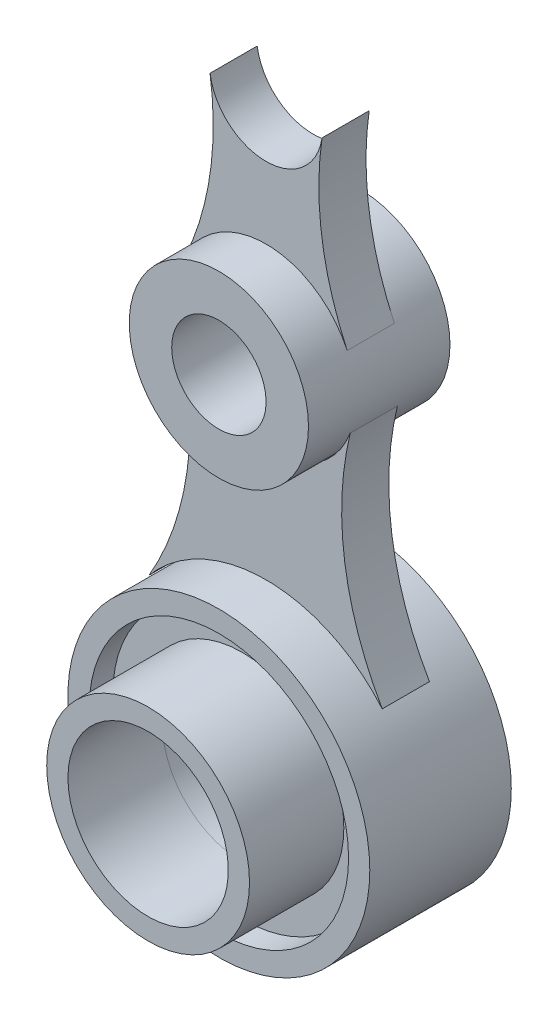
ISO-10303-21;
HEADER;
FILE_DESCRIPTION(('STEP AP214'),'2;1');
FILE_NAME('part.step','',(''),(''),'','','');
FILE_SCHEMA(('AUTOMOTIVE_DESIGN { 1 0 10303 214 1 1 1 1 }'));
ENDSEC;
DATA;
#1=APPLICATION_CONTEXT('core data for automotive mechanical design processes');
#2=APPLICATION_PROTOCOL_DEFINITION('international standard','automotive_design',2000,#1);
#3=PRODUCT_CONTEXT('',#1,'mechanical');
#4=PRODUCT('Part','Part','',(#3));
#5=PRODUCT_RELATED_PRODUCT_CATEGORY('part','',(#4));
#6=PRODUCT_DEFINITION_FORMATION('','',#4);
#7=PRODUCT_DEFINITION_CONTEXT('part definition',#1,'design');
#8=PRODUCT_DEFINITION('design','',#6,#7);
#9=PRODUCT_DEFINITION_SHAPE('','',#8);
#10=(LENGTH_UNIT() NAMED_UNIT(*) SI_UNIT(.MILLI.,.METRE.));
#11=(NAMED_UNIT(*) PLANE_ANGLE_UNIT() SI_UNIT($,.RADIAN.));
#12=(NAMED_UNIT(*) SI_UNIT($,.STERADIAN.) SOLID_ANGLE_UNIT());
#13=UNCERTAINTY_MEASURE_WITH_UNIT(LENGTH_MEASURE(1.E-05),#10,'distance_accuracy_value','');
#14=(GEOMETRIC_REPRESENTATION_CONTEXT(3) GLOBAL_UNCERTAINTY_ASSIGNED_CONTEXT((#13)) GLOBAL_UNIT_ASSIGNED_CONTEXT((#10,
#11,#12)) REPRESENTATION_CONTEXT('',''));
#15=CARTESIAN_POINT('',(0.,0.,0.));
#16=DIRECTION('',(0.,0.,1.));
#17=DIRECTION('',(1.,0.,0.));
#18=AXIS2_PLACEMENT_3D('',#15,#16,#17);
#19=CARTESIAN_POINT('',(3.85775487195288,-22.9324343422919,45.));
#20=DIRECTION('',(0.,0.,-1.));
#21=DIRECTION('',(-1.,0.,0.));
#22=AXIS2_PLACEMENT_3D('',#19,#20,#21);
#23=CYLINDRICAL_SURFACE('',#22,21.5);
#24=CARTESIAN_POINT('',(3.85775487195288,-22.9324343422919,45.));
#25=DIRECTION('',(0.,0.,1.));
#26=DIRECTION('',(1.,0.,0.));
#27=AXIS2_PLACEMENT_3D('',#24,#25,#26);
#28=CIRCLE('',#27,21.5);
#29=CARTESIAN_POINT('',(25.3577548719529,-22.9324343422919,45.));
#30=VERTEX_POINT('',#29);
#31=EDGE_CURVE('E11',#30,#30,#28,.T.);
#32=ORIENTED_EDGE('',*,*,#31,.F.);
#33=EDGE_LOOP('',(#32));
#34=FACE_BOUND('',#33,.T.);
#35=CARTESIAN_POINT('',(3.85775487195288,-22.9324343422919,25.));
#36=DIRECTION('',(0.,0.,1.));
#37=DIRECTION('',(1.,0.,0.));
#38=AXIS2_PLACEMENT_3D('',#35,#36,#37);
#39=CIRCLE('',#38,21.5);
#40=CARTESIAN_POINT('',(25.3577548719529,-22.9324343422919,25.));
#41=VERTEX_POINT('',#40);
#42=EDGE_CURVE('E51',#41,#41,#39,.T.);
#43=ORIENTED_EDGE('',*,*,#42,.T.);
#44=EDGE_LOOP('',(#43));
#45=FACE_BOUND('',#44,.T.);
#46=ADVANCED_FACE('F44',(#34,#45),#23,.T.);
#47=CARTESIAN_POINT('',(3.85775487195288,-22.9324343422919,45.));
#48=DIRECTION('',(0.,0.,1.));
#49=DIRECTION('',(1.,0.,0.));
#50=AXIS2_PLACEMENT_3D('',#47,#48,#49);
#51=PLANE('',#50);
#52=CARTESIAN_POINT('',(3.85775487195288,-22.9324343422919,45.));
#53=DIRECTION('',(0.,0.,1.));
#54=DIRECTION('',(1.,0.,0.));
#55=AXIS2_PLACEMENT_3D('',#52,#53,#54);
#56=CIRCLE('',#55,17.);
#57=CARTESIAN_POINT('',(-13.1422451280471,-22.9324343422919,45.));
#58=VERTEX_POINT('',#57);
#59=EDGE_CURVE('E57',#58,#58,#56,.T.);
#60=ORIENTED_EDGE('',*,*,#59,.F.);
#61=EDGE_LOOP('',(#60));
#62=FACE_BOUND('',#61,.T.);
#63=ORIENTED_EDGE('',*,*,#31,.T.);
#64=EDGE_LOOP('',(#63));
#65=FACE_BOUND('',#64,.T.);
#66=ADVANCED_FACE('F69',(#62,#65),#51,.T.);
#67=CARTESIAN_POINT('',(3.85775487195288,-22.9324343422919,25.));
#68=DIRECTION('',(0.,0.,1.));
#69=DIRECTION('',(1.,0.,0.));
#70=AXIS2_PLACEMENT_3D('',#67,#68,#69);
#71=PLANE('',#70);
#72=CARTESIAN_POINT('',(3.85775487195288,-22.9324343422919,25.));
#73=DIRECTION('',(0.,0.,1.));
#74=DIRECTION('',(1.,0.,0.));
#75=AXIS2_PLACEMENT_3D('',#72,#73,#74);
#76=CIRCLE('',#75,17.);
#77=CARTESIAN_POINT('',(-13.1422451280471,-22.9324343422919,25.));
#78=VERTEX_POINT('',#77);
#79=EDGE_CURVE('E47',#78,#78,#76,.F.);
#80=ORIENTED_EDGE('',*,*,#79,.F.);
#81=EDGE_LOOP('',(#80));
#82=FACE_BOUND('',#81,.T.);
#83=ORIENTED_EDGE('',*,*,#42,.F.);
#84=EDGE_LOOP('',(#83));
#85=FACE_BOUND('',#84,.T.);
#86=ADVANCED_FACE('F66',(#82,#85),#71,.F.);
#87=CARTESIAN_POINT('',(3.85775487195288,-22.9324343422919,45.));
#88=DIRECTION('',(0.,0.,-1.));
#89=DIRECTION('',(-1.,0.,0.));
#90=AXIS2_PLACEMENT_3D('',#87,#88,#89);
#91=CYLINDRICAL_SURFACE('',#90,17.);
#92=CARTESIAN_POINT('',(-13.1422451280471,-22.9324343422919,45.));
#93=CARTESIAN_POINT('',(-13.1422451280471,-22.9324343422919,44.7916666666667));
#94=CARTESIAN_POINT('',(-13.1422451280471,-22.9324343422919,44.5833333333333));
#95=CARTESIAN_POINT('',(-13.1422451280471,-22.9324343422919,44.1666666666667));
#96=CARTESIAN_POINT('',(-13.1422451280471,-22.9324343422919,43.9583333333333));
#97=CARTESIAN_POINT('',(-13.1422451280471,-22.9324343422919,43.5416666666667));
#98=CARTESIAN_POINT('',(-13.1422451280471,-22.9324343422919,43.3333333333333));
#99=CARTESIAN_POINT('',(-13.1422451280471,-22.9324343422919,42.9166666666667));
#100=CARTESIAN_POINT('',(-13.1422451280471,-22.9324343422919,42.7083333333333));
#101=CARTESIAN_POINT('',(-13.1422451280471,-22.9324343422919,42.2916666666667));
#102=CARTESIAN_POINT('',(-13.1422451280471,-22.9324343422919,42.0833333333333));
#103=CARTESIAN_POINT('',(-13.1422451280471,-22.9324343422919,41.6666666666667));
#104=CARTESIAN_POINT('',(-13.1422451280471,-22.9324343422919,41.4583333333333));
#105=CARTESIAN_POINT('',(-13.1422451280471,-22.9324343422919,41.0416666666667));
#106=CARTESIAN_POINT('',(-13.1422451280471,-22.9324343422919,40.8333333333333));
#107=CARTESIAN_POINT('',(-13.1422451280471,-22.9324343422919,40.4166666666667));
#108=CARTESIAN_POINT('',(-13.1422451280471,-22.9324343422919,40.2083333333333));
#109=CARTESIAN_POINT('',(-13.1422451280471,-22.9324343422919,39.7916666666667));
#110=CARTESIAN_POINT('',(-13.1422451280471,-22.9324343422919,39.5833333333333));
#111=CARTESIAN_POINT('',(-13.1422451280471,-22.9324343422919,39.1666666666667));
#112=CARTESIAN_POINT('',(-13.1422451280471,-22.9324343422919,38.9583333333333));
#113=CARTESIAN_POINT('',(-13.1422451280471,-22.9324343422919,38.5416666666667));
#114=CARTESIAN_POINT('',(-13.1422451280471,-22.9324343422919,38.3333333333333));
#115=CARTESIAN_POINT('',(-13.1422451280471,-22.9324343422919,37.9166666666667));
#116=CARTESIAN_POINT('',(-13.1422451280471,-22.9324343422919,37.7083333333333));
#117=CARTESIAN_POINT('',(-13.1422451280471,-22.9324343422919,37.2916666666667));
#118=CARTESIAN_POINT('',(-13.1422451280471,-22.9324343422919,37.0833333333333));
#119=CARTESIAN_POINT('',(-13.1422451280471,-22.9324343422919,36.6666666666667));
#120=CARTESIAN_POINT('',(-13.1422451280471,-22.9324343422919,36.4583333333333));
#121=CARTESIAN_POINT('',(-13.1422451280471,-22.9324343422919,36.0416666666667));
#122=CARTESIAN_POINT('',(-13.1422451280471,-22.9324343422919,35.8333333333333));
#123=CARTESIAN_POINT('',(-13.1422451280471,-22.9324343422919,35.4166666666667));
#124=CARTESIAN_POINT('',(-13.1422451280471,-22.9324343422919,35.2083333333333));
#125=CARTESIAN_POINT('',(-13.1422451280471,-22.9324343422919,34.7916666666667));
#126=CARTESIAN_POINT('',(-13.1422451280471,-22.9324343422919,34.5833333333333));
#127=CARTESIAN_POINT('',(-13.1422451280471,-22.9324343422919,34.1666666666667));
#128=CARTESIAN_POINT('',(-13.1422451280471,-22.9324343422919,33.9583333333333));
#129=CARTESIAN_POINT('',(-13.1422451280471,-22.9324343422919,33.5416666666667));
#130=CARTESIAN_POINT('',(-13.1422451280471,-22.9324343422919,33.3333333333333));
#131=CARTESIAN_POINT('',(-13.1422451280471,-22.9324343422919,32.9166666666667));
#132=CARTESIAN_POINT('',(-13.1422451280471,-22.9324343422919,32.7083333333333));
#133=CARTESIAN_POINT('',(-13.1422451280471,-22.9324343422919,32.2916666666667));
#134=CARTESIAN_POINT('',(-13.1422451280471,-22.9324343422919,32.0833333333333));
#135=CARTESIAN_POINT('',(-13.1422451280471,-22.9324343422919,31.6666666666667));
#136=CARTESIAN_POINT('',(-13.1422451280471,-22.9324343422919,31.4583333333333));
#137=CARTESIAN_POINT('',(-13.1422451280471,-22.9324343422919,31.0416666666667));
#138=CARTESIAN_POINT('',(-13.1422451280471,-22.9324343422919,30.8333333333333));
#139=CARTESIAN_POINT('',(-13.1422451280471,-22.9324343422919,30.4166666666667));
#140=CARTESIAN_POINT('',(-13.1422451280471,-22.9324343422919,30.2083333333333));
#141=CARTESIAN_POINT('',(-13.1422451280471,-22.9324343422919,29.7916666666667));
#142=CARTESIAN_POINT('',(-13.1422451280471,-22.9324343422919,29.5833333333333));
#143=CARTESIAN_POINT('',(-13.1422451280471,-22.9324343422919,29.1666666666667));
#144=CARTESIAN_POINT('',(-13.1422451280471,-22.9324343422919,28.9583333333333));
#145=CARTESIAN_POINT('',(-13.1422451280471,-22.9324343422919,28.5416666666667));
#146=CARTESIAN_POINT('',(-13.1422451280471,-22.9324343422919,28.3333333333333));
#147=CARTESIAN_POINT('',(-13.1422451280471,-22.9324343422919,27.9166666666667));
#148=CARTESIAN_POINT('',(-13.1422451280471,-22.9324343422919,27.7083333333333));
#149=CARTESIAN_POINT('',(-13.1422451280471,-22.9324343422919,27.2916666666667));
#150=CARTESIAN_POINT('',(-13.1422451280471,-22.9324343422919,27.0833333333333));
#151=CARTESIAN_POINT('',(-13.1422451280471,-22.9324343422919,26.6666666666667));
#152=CARTESIAN_POINT('',(-13.1422451280471,-22.9324343422919,26.4583333333333));
#153=CARTESIAN_POINT('',(-13.1422451280471,-22.9324343422919,26.0416666666667));
#154=CARTESIAN_POINT('',(-13.1422451280471,-22.9324343422919,25.8333333333333));
#155=CARTESIAN_POINT('',(-13.1422451280471,-22.9324343422919,25.4166666666667));
#156=CARTESIAN_POINT('',(-13.1422451280471,-22.9324343422919,25.2083333333333));
#157=CARTESIAN_POINT('',(-13.1422451280471,-22.9324343422919,25.));
#158=B_SPLINE_CURVE_WITH_KNOTS('',3,(#92,#93,#94,#95,#96,#97,#98,#99,#100,#101,#102,#103,#104,
#105,#106,#107,#108,#109,#110,#111,#112,#113,#114,#115,#116,#117,#118,#119,#120,#121,#122,#123,
#124,#125,#126,#127,#128,#129,#130,#131,#132,#133,#134,#135,#136,#137,#138,#139,#140,#141,#142,
#143,#144,#145,#146,#147,#148,#149,#150,#151,#152,#153,#154,#155,#156,#157),.UNSPECIFIED.,.F.,
.F.,(4,2,2,2,2,2,2,2,2,2,2,2,2,2,2,2,2,2,2,2,2,2,2,2,2,2,2,2,2,2,2,2,4),(0.,0.625000000000001,
1.25,1.875,2.5,3.125,3.75,4.375,5.,5.62500000000001,6.25000000000001,6.87500000000001,7.5,8.125,
8.75,9.375,10.,10.625,11.25,11.875,12.5,13.125,13.75,14.375,15.,15.625,16.25,16.875,17.5,18.125,
18.75,19.375,20.),.UNSPECIFIED.);
#159=EDGE_CURVE('BSEAM64',#58,#78,#158,.T.);
#160=ORIENTED_EDGE('',*,*,#59,.T.);
#161=ORIENTED_EDGE('',*,*,#79,.T.);
#162=ORIENTED_EDGE('',*,*,#159,.T.);
#163=ORIENTED_EDGE('',*,*,#159,.F.);
#164=EDGE_LOOP('',(#160,#162,#161,#163));
#165=FACE_BOUND('',#164,.T.);
#166=ADVANCED_FACE('F64',(#165),#91,.F.);
#167=CLOSED_SHELL('',(#46,#66,#86,#166));
#168=MANIFOLD_SOLID_BREP('B2',#167);
#169=CARTESIAN_POINT('',(3.85775487195288,52.0675656577081,20.));
#170=DIRECTION('',(0.,0.,-1.));
#171=DIRECTION('',(-1.,0.,0.));
#172=AXIS2_PLACEMENT_3D('',#169,#170,#171);
#173=CYLINDRICAL_SURFACE('',#172,19.1140032956474);
#174=CARTESIAN_POINT('',(3.85775487195288,52.0675656577081,10.));
#175=DIRECTION('',(0.,0.,1.));
#176=DIRECTION('',(1.,0.,0.));
#177=AXIS2_PLACEMENT_3D('',#174,#175,#176);
#178=CIRCLE('',#177,19.1140032956474);
#179=CARTESIAN_POINT('',(-14.1336658812878,45.6135822934687,10.));
#180=VERTEX_POINT('',#179);
#181=CARTESIAN_POINT('',(21.7194099460259,45.2626850561943,10.));
#182=VERTEX_POINT('',#181);
#183=EDGE_CURVE('E177',#180,#182,#178,.T.);
#184=ORIENTED_EDGE('',*,*,#183,.F.);
#185=DIRECTION('',(0.,0.,-1.));
#186=VECTOR('',#185,1.);
#187=CARTESIAN_POINT('',(-14.1336658812878,45.6135822934687,20.));
#188=LINE('',#187,#186);
#189=CARTESIAN_POINT('',(-14.1336658812878,45.6135822934687,20.));
#190=VERTEX_POINT('',#189);
#191=EDGE_CURVE('E42',#190,#180,#188,.T.);
#192=ORIENTED_EDGE('',*,*,#191,.F.);
#193=CARTESIAN_POINT('',(3.85775487195288,52.0675656577081,20.));
#194=DIRECTION('',(0.,0.,1.));
#195=DIRECTION('',(1.,0.,0.));
#196=AXIS2_PLACEMENT_3D('',#193,#194,#195);
#197=CIRCLE('',#196,19.1140032956474);
#198=CARTESIAN_POINT('',(21.7194099460259,45.2626850561943,20.));
#199=VERTEX_POINT('',#198);
#200=EDGE_CURVE('E162',#190,#199,#197,.T.);
#201=ORIENTED_EDGE('',*,*,#200,.T.);
#202=DIRECTION('',(0.,0.,-1.));
#203=VECTOR('',#202,1.);
#204=CARTESIAN_POINT('',(21.7194099460259,45.2626850561943,20.));
#205=LINE('',#204,#203);
#206=EDGE_CURVE('E130',#199,#182,#205,.T.);
#207=ORIENTED_EDGE('',*,*,#206,.T.);
#208=EDGE_LOOP('',(#184,#192,#201,#207));
#209=FACE_BOUND('',#208,.T.);
#210=ADVANCED_FACE('F114',(#209),#173,.F.);
#211=CARTESIAN_POINT('',(-76.2256850609005,30.102903578512,20.));
#212=DIRECTION('',(0.,0.,-1.));
#213=DIRECTION('',(-1.,0.,0.));
#214=AXIS2_PLACEMENT_3D('',#211,#212,#213);
#215=CYLINDRICAL_SURFACE('',#214,64.);
#216=CARTESIAN_POINT('',(-76.2256850609005,30.102903578512,10.));
#217=DIRECTION('',(0.,0.,1.));
#218=DIRECTION('',(1.,0.,0.));
#219=AXIS2_PLACEMENT_3D('',#216,#217,#218);
#220=CIRCLE('',#219,64.);
#221=CARTESIAN_POINT('',(-20.9821591681092,-2.21045042463196,10.));
#222=VERTEX_POINT('',#221);
#223=EDGE_CURVE('E168',#180,#222,#220,.F.);
#224=ORIENTED_EDGE('',*,*,#223,.T.);
#225=DIRECTION('',(0.,0.,-1.));
#226=VECTOR('',#225,1.);
#227=CARTESIAN_POINT('',(-20.9821591681092,-2.21045042463196,20.));
#228=LINE('',#227,#226);
#229=CARTESIAN_POINT('',(-20.9821591681092,-2.21045042463196,20.));
#230=VERTEX_POINT('',#229);
#231=EDGE_CURVE('E122',#230,#222,#228,.T.);
#232=ORIENTED_EDGE('',*,*,#231,.F.);
#233=CARTESIAN_POINT('',(-76.2256850609005,30.102903578512,20.));
#234=DIRECTION('',(0.,0.,1.));
#235=DIRECTION('',(1.,0.,0.));
#236=AXIS2_PLACEMENT_3D('',#233,#234,#235);
#237=CIRCLE('',#236,64.);
#238=EDGE_CURVE('E156',#190,#230,#237,.F.);
#239=ORIENTED_EDGE('',*,*,#238,.F.);
#240=ORIENTED_EDGE('',*,*,#191,.T.);
#241=EDGE_LOOP('',(#224,#232,#239,#240));
#242=FACE_BOUND('',#241,.T.);
#243=ADVANCED_FACE('F166',(#242),#215,.F.);
#244=CARTESIAN_POINT('',(3.85775487195288,-22.9324343422919,20.));
#245=DIRECTION('',(0.,0.,-1.));
#246=DIRECTION('',(-1.,0.,0.));
#247=AXIS2_PLACEMENT_3D('',#244,#245,#246);
#248=CYLINDRICAL_SURFACE('',#247,32.348445820494);
#249=CARTESIAN_POINT('',(3.85775487195288,-22.9324343422919,10.));
#250=DIRECTION('',(0.,0.,1.));
#251=DIRECTION('',(1.,0.,0.));
#252=AXIS2_PLACEMENT_3D('',#249,#250,#251);
#253=CIRCLE('',#252,32.348445820494);
#254=CARTESIAN_POINT('',(28.4993570682115,-1.97501588956315,10.));
#255=VERTEX_POINT('',#254);
#256=EDGE_CURVE('E180',#255,#222,#253,.T.);
#257=ORIENTED_EDGE('',*,*,#256,.F.);
#258=DIRECTION('',(0.,0.,-1.));
#259=VECTOR('',#258,1.);
#260=CARTESIAN_POINT('',(28.4993570682115,-1.97501588956315,20.));
#261=LINE('',#260,#259);
#262=CARTESIAN_POINT('',(28.4993570682115,-1.97501588956315,20.));
#263=VERTEX_POINT('',#262);
#264=EDGE_CURVE('E143',#263,#255,#261,.T.);
#265=ORIENTED_EDGE('',*,*,#264,.F.);
#266=CARTESIAN_POINT('',(3.85775487195288,-22.9324343422919,20.));
#267=DIRECTION('',(0.,0.,1.));
#268=DIRECTION('',(1.,0.,0.));
#269=AXIS2_PLACEMENT_3D('',#266,#267,#268);
#270=CIRCLE('',#269,32.348445820494);
#271=EDGE_CURVE('E161',#263,#230,#270,.T.);
#272=ORIENTED_EDGE('',*,*,#271,.T.);
#273=ORIENTED_EDGE('',*,*,#231,.T.);
#274=EDGE_LOOP('',(#257,#265,#272,#273));
#275=FACE_BOUND('',#274,.T.);
#276=ADVANCED_FACE('F171',(#275),#248,.F.);
#277=CARTESIAN_POINT('',(83.8926628114819,30.0808989910414,20.));
#278=DIRECTION('',(0.,0.,-1.));
#279=DIRECTION('',(-1.,0.,0.));
#280=AXIS2_PLACEMENT_3D('',#277,#278,#279);
#281=CYLINDRICAL_SURFACE('',#280,64.);
#282=CARTESIAN_POINT('',(83.8926628114819,30.0808989910414,10.));
#283=DIRECTION('',(0.,0.,1.));
#284=DIRECTION('',(1.,0.,0.));
#285=AXIS2_PLACEMENT_3D('',#282,#283,#284);
#286=CIRCLE('',#285,64.);
#287=EDGE_CURVE('E182',#182,#255,#286,.T.);
#288=ORIENTED_EDGE('',*,*,#287,.F.);
#289=ORIENTED_EDGE('',*,*,#206,.F.);
#290=CARTESIAN_POINT('',(83.8926628114819,30.0808989910414,20.));
#291=DIRECTION('',(0.,0.,1.));
#292=DIRECTION('',(1.,0.,0.));
#293=AXIS2_PLACEMENT_3D('',#290,#291,#292);
#294=CIRCLE('',#293,64.);
#295=EDGE_CURVE('E172',#199,#263,#294,.T.);
#296=ORIENTED_EDGE('',*,*,#295,.T.);
#297=ORIENTED_EDGE('',*,*,#264,.T.);
#298=EDGE_LOOP('',(#288,#289,#296,#297));
#299=FACE_BOUND('',#298,.T.);
#300=ADVANCED_FACE('F187',(#299),#281,.F.);
#301=CARTESIAN_POINT('',(0.,0.,20.));
#302=DIRECTION('',(0.,0.,1.));
#303=DIRECTION('',(1.,0.,0.));
#304=AXIS2_PLACEMENT_3D('',#301,#302,#303);
#305=PLANE('',#304);
#306=ORIENTED_EDGE('',*,*,#200,.F.);
#307=ORIENTED_EDGE('',*,*,#238,.T.);
#308=ORIENTED_EDGE('',*,*,#271,.F.);
#309=ORIENTED_EDGE('',*,*,#295,.F.);
#310=EDGE_LOOP('',(#306,#307,#308,#309));
#311=FACE_BOUND('',#310,.T.);
#312=ADVANCED_FACE('F158',(#311),#305,.T.);
#313=CARTESIAN_POINT('',(0.,0.,10.));
#314=DIRECTION('',(0.,0.,1.));
#315=DIRECTION('',(1.,0.,0.));
#316=AXIS2_PLACEMENT_3D('',#313,#314,#315);
#317=PLANE('',#316);
#318=ORIENTED_EDGE('',*,*,#183,.T.);
#319=ORIENTED_EDGE('',*,*,#287,.T.);
#320=ORIENTED_EDGE('',*,*,#256,.T.);
#321=ORIENTED_EDGE('',*,*,#223,.F.);
#322=EDGE_LOOP('',(#318,#319,#320,#321));
#323=FACE_BOUND('',#322,.T.);
#324=ADVANCED_FACE('F194',(#323),#317,.F.);
#325=CLOSED_SHELL('',(#210,#243,#276,#300,#312,#324));
#326=MANIFOLD_SOLID_BREP('B6',#325);
#327=CARTESIAN_POINT('',(3.85775487195288,-22.9324343422919,30.));
#328=DIRECTION('',(0.,0.,-1.));
#329=DIRECTION('',(-1.,0.,0.));
#330=AXIS2_PLACEMENT_3D('',#327,#328,#329);
#331=CYLINDRICAL_SURFACE('',#330,32.);
#332=CARTESIAN_POINT('',(3.85775487195288,-22.9324343422919,30.));
#333=DIRECTION('',(0.,0.,1.));
#334=DIRECTION('',(1.,0.,0.));
#335=AXIS2_PLACEMENT_3D('',#332,#333,#334);
#336=CIRCLE('',#335,32.);
#337=CARTESIAN_POINT('',(35.8577548719529,-22.9324343422919,30.));
#338=VERTEX_POINT('',#337);
#339=EDGE_CURVE('E113',#338,#338,#336,.T.);
#340=ORIENTED_EDGE('',*,*,#339,.F.);
#341=EDGE_LOOP('',(#340));
#342=FACE_BOUND('',#341,.T.);
#343=CARTESIAN_POINT('',(3.85775487195288,-22.9324343422919,0.));
#344=DIRECTION('',(0.,0.,1.));
#345=DIRECTION('',(1.,0.,0.));
#346=AXIS2_PLACEMENT_3D('',#343,#344,#345);
#347=CIRCLE('',#346,32.);
#348=CARTESIAN_POINT('',(35.8577548719529,-22.9324343422919,0.));
#349=VERTEX_POINT('',#348);
#350=EDGE_CURVE('E254',#349,#349,#347,.T.);
#351=ORIENTED_EDGE('',*,*,#350,.T.);
#352=EDGE_LOOP('',(#351));
#353=FACE_BOUND('',#352,.T.);
#354=ADVANCED_FACE('F247',(#342,#353),#331,.T.);
#355=CARTESIAN_POINT('',(3.85775487195288,-22.9324343422919,30.));
#356=DIRECTION('',(0.,0.,1.));
#357=DIRECTION('',(1.,0.,0.));
#358=AXIS2_PLACEMENT_3D('',#355,#356,#357);
#359=PLANE('',#358);
#360=CARTESIAN_POINT('',(3.85775487195288,-22.9324343422919,30.));
#361=DIRECTION('',(0.,0.,1.));
#362=DIRECTION('',(1.,0.,0.));
#363=AXIS2_PLACEMENT_3D('',#360,#361,#362);
#364=CIRCLE('',#363,27.5);
#365=CARTESIAN_POINT('',(31.3577548719529,-22.9324343422919,30.));
#366=VERTEX_POINT('',#365);
#367=EDGE_CURVE('E259',#366,#366,#364,.T.);
#368=ORIENTED_EDGE('',*,*,#367,.F.);
#369=EDGE_LOOP('',(#368));
#370=FACE_BOUND('',#369,.T.);
#371=ORIENTED_EDGE('',*,*,#339,.T.);
#372=EDGE_LOOP('',(#371));
#373=FACE_BOUND('',#372,.T.);
#374=ADVANCED_FACE('F286',(#370,#373),#359,.T.);
#375=CARTESIAN_POINT('',(3.85775487195288,-22.9324343422919,0.));
#376=DIRECTION('',(0.,0.,1.));
#377=DIRECTION('',(1.,0.,0.));
#378=AXIS2_PLACEMENT_3D('',#375,#376,#377);
#379=PLANE('',#378);
#380=CARTESIAN_POINT('',(3.85775487195288,-22.9324343422919,0.));
#381=DIRECTION('',(0.,0.,1.));
#382=DIRECTION('',(1.,0.,0.));
#383=AXIS2_PLACEMENT_3D('',#380,#381,#382);
#384=CIRCLE('',#383,17.);
#385=CARTESIAN_POINT('',(-13.1422451280471,-22.9324343422919,0.));
#386=VERTEX_POINT('',#385);
#387=EDGE_CURVE('E266',#386,#386,#384,.T.);
#388=ORIENTED_EDGE('',*,*,#387,.T.);
#389=EDGE_LOOP('',(#388));
#390=FACE_BOUND('',#389,.T.);
#391=ORIENTED_EDGE('',*,*,#350,.F.);
#392=EDGE_LOOP('',(#391));
#393=FACE_BOUND('',#392,.T.);
#394=ADVANCED_FACE('F291',(#390,#393),#379,.F.);
#395=CARTESIAN_POINT('',(3.85775487195288,-22.9324343422919,30.));
#396=DIRECTION('',(0.,0.,-1.));
#397=DIRECTION('',(-1.,0.,0.));
#398=AXIS2_PLACEMENT_3D('',#395,#396,#397);
#399=CYLINDRICAL_SURFACE('',#398,27.5);
#400=ORIENTED_EDGE('',*,*,#367,.T.);
#401=EDGE_LOOP('',(#400));
#402=FACE_BOUND('',#401,.T.);
#403=CARTESIAN_POINT('',(3.85775487195288,-22.9324343422919,25.));
#404=DIRECTION('',(0.,0.,1.));
#405=DIRECTION('',(1.,0.,0.));
#406=AXIS2_PLACEMENT_3D('',#403,#404,#405);
#407=CIRCLE('',#406,27.5);
#408=CARTESIAN_POINT('',(31.3577548719529,-22.9324343422919,25.));
#409=VERTEX_POINT('',#408);
#410=EDGE_CURVE('E261',#409,#409,#407,.T.);
#411=ORIENTED_EDGE('',*,*,#410,.F.);
#412=EDGE_LOOP('',(#411));
#413=FACE_BOUND('',#412,.T.);
#414=ADVANCED_FACE('F283',(#402,#413),#399,.F.);
#415=CARTESIAN_POINT('',(3.85775487195288,-22.9324343422919,25.));
#416=DIRECTION('',(0.,0.,1.));
#417=DIRECTION('',(1.,0.,0.));
#418=AXIS2_PLACEMENT_3D('',#415,#416,#417);
#419=PLANE('',#418);
#420=CARTESIAN_POINT('',(3.85775487195288,-22.9324343422919,25.));
#421=DIRECTION('',(0.,0.,1.));
#422=DIRECTION('',(1.,0.,0.));
#423=AXIS2_PLACEMENT_3D('',#420,#421,#422);
#424=CIRCLE('',#423,17.);
#425=CARTESIAN_POINT('',(-13.1422451280471,-22.9324343422919,25.));
#426=VERTEX_POINT('',#425);
#427=EDGE_CURVE('E250',#426,#426,#424,.F.);
#428=ORIENTED_EDGE('',*,*,#427,.T.);
#429=EDGE_LOOP('',(#428));
#430=FACE_BOUND('',#429,.T.);
#431=ORIENTED_EDGE('',*,*,#410,.T.);
#432=EDGE_LOOP('',(#431));
#433=FACE_BOUND('',#432,.T.);
#434=ADVANCED_FACE('F273',(#430,#433),#419,.T.);
#435=CARTESIAN_POINT('',(3.85775487195288,-22.9324343422919,45.));
#436=DIRECTION('',(0.,0.,-1.));
#437=DIRECTION('',(-1.,0.,0.));
#438=AXIS2_PLACEMENT_3D('',#435,#436,#437);
#439=CYLINDRICAL_SURFACE('',#438,17.);
#440=CARTESIAN_POINT('',(-13.1422451280471,-22.9324343422919,25.));
#441=CARTESIAN_POINT('',(-13.1422451280471,-22.9324343422919,24.7395833333333));
#442=CARTESIAN_POINT('',(-13.1422451280471,-22.9324343422919,24.4791666666667));
#443=CARTESIAN_POINT('',(-13.1422451280471,-22.9324343422919,23.9583333333333));
#444=CARTESIAN_POINT('',(-13.1422451280471,-22.9324343422919,23.6979166666667));
#445=CARTESIAN_POINT('',(-13.1422451280471,-22.9324343422919,23.1770833333333));
#446=CARTESIAN_POINT('',(-13.1422451280471,-22.9324343422919,22.9166666666667));
#447=CARTESIAN_POINT('',(-13.1422451280471,-22.9324343422919,22.3958333333333));
#448=CARTESIAN_POINT('',(-13.1422451280471,-22.9324343422919,22.1354166666667));
#449=CARTESIAN_POINT('',(-13.1422451280471,-22.9324343422919,21.6145833333333));
#450=CARTESIAN_POINT('',(-13.1422451280471,-22.9324343422919,21.3541666666667));
#451=CARTESIAN_POINT('',(-13.1422451280471,-22.9324343422919,20.8333333333333));
#452=CARTESIAN_POINT('',(-13.1422451280471,-22.9324343422919,20.5729166666667));
#453=CARTESIAN_POINT('',(-13.1422451280471,-22.9324343422919,20.0520833333333));
#454=CARTESIAN_POINT('',(-13.1422451280471,-22.9324343422919,19.7916666666667));
#455=CARTESIAN_POINT('',(-13.1422451280471,-22.9324343422919,19.2708333333333));
#456=CARTESIAN_POINT('',(-13.1422451280471,-22.9324343422919,19.0104166666667));
#457=CARTESIAN_POINT('',(-13.1422451280471,-22.9324343422919,18.4895833333333));
#458=CARTESIAN_POINT('',(-13.1422451280471,-22.9324343422919,18.2291666666667));
#459=CARTESIAN_POINT('',(-13.1422451280471,-22.9324343422919,17.7083333333333));
#460=CARTESIAN_POINT('',(-13.1422451280471,-22.9324343422919,17.4479166666667));
#461=CARTESIAN_POINT('',(-13.1422451280471,-22.9324343422919,16.9270833333333));
#462=CARTESIAN_POINT('',(-13.1422451280471,-22.9324343422919,16.6666666666667));
#463=CARTESIAN_POINT('',(-13.1422451280471,-22.9324343422919,16.1458333333333));
#464=CARTESIAN_POINT('',(-13.1422451280471,-22.9324343422919,15.8854166666667));
#465=CARTESIAN_POINT('',(-13.1422451280471,-22.9324343422919,15.3645833333333));
#466=CARTESIAN_POINT('',(-13.1422451280471,-22.9324343422919,15.1041666666667));
#467=CARTESIAN_POINT('',(-13.1422451280471,-22.9324343422919,14.5833333333333));
#468=CARTESIAN_POINT('',(-13.1422451280471,-22.9324343422919,14.3229166666667));
#469=CARTESIAN_POINT('',(-13.1422451280471,-22.9324343422919,13.8020833333333));
#470=CARTESIAN_POINT('',(-13.1422451280471,-22.9324343422919,13.5416666666667));
#471=CARTESIAN_POINT('',(-13.1422451280471,-22.9324343422919,13.0208333333333));
#472=CARTESIAN_POINT('',(-13.1422451280471,-22.9324343422919,12.7604166666667));
#473=CARTESIAN_POINT('',(-13.1422451280471,-22.9324343422919,12.2395833333333));
#474=CARTESIAN_POINT('',(-13.1422451280471,-22.9324343422919,11.9791666666667));
#475=CARTESIAN_POINT('',(-13.1422451280471,-22.9324343422919,11.4583333333333));
#476=CARTESIAN_POINT('',(-13.1422451280471,-22.9324343422919,11.1979166666667));
#477=CARTESIAN_POINT('',(-13.1422451280471,-22.9324343422919,10.6770833333333));
#478=CARTESIAN_POINT('',(-13.1422451280471,-22.9324343422919,10.4166666666667));
#479=CARTESIAN_POINT('',(-13.1422451280471,-22.9324343422919,9.89583333333333));
#480=CARTESIAN_POINT('',(-13.1422451280471,-22.9324343422919,9.63541666666666));
#481=CARTESIAN_POINT('',(-13.1422451280471,-22.9324343422919,9.11458333333333));
#482=CARTESIAN_POINT('',(-13.1422451280471,-22.9324343422919,8.85416666666666));
#483=CARTESIAN_POINT('',(-13.1422451280471,-22.9324343422919,8.33333333333333));
#484=CARTESIAN_POINT('',(-13.1422451280471,-22.9324343422919,8.07291666666666));
#485=CARTESIAN_POINT('',(-13.1422451280471,-22.9324343422919,7.55208333333333));
#486=CARTESIAN_POINT('',(-13.1422451280471,-22.9324343422919,7.29166666666666));
#487=CARTESIAN_POINT('',(-13.1422451280471,-22.9324343422919,6.77083333333333));
#488=CARTESIAN_POINT('',(-13.1422451280471,-22.9324343422919,6.51041666666666));
#489=CARTESIAN_POINT('',(-13.1422451280471,-22.9324343422919,5.98958333333333));
#490=CARTESIAN_POINT('',(-13.1422451280471,-22.9324343422919,5.72916666666666));
#491=CARTESIAN_POINT('',(-13.1422451280471,-22.9324343422919,5.20833333333333));
#492=CARTESIAN_POINT('',(-13.1422451280471,-22.9324343422919,4.94791666666666));
#493=CARTESIAN_POINT('',(-13.1422451280471,-22.9324343422919,4.42708333333332));
#494=CARTESIAN_POINT('',(-13.1422451280471,-22.9324343422919,4.16666666666666));
#495=CARTESIAN_POINT('',(-13.1422451280471,-22.9324343422919,3.64583333333333));
#496=CARTESIAN_POINT('',(-13.1422451280471,-22.9324343422919,3.38541666666666));
#497=CARTESIAN_POINT('',(-13.1422451280471,-22.9324343422919,2.86458333333333));
#498=CARTESIAN_POINT('',(-13.1422451280471,-22.9324343422919,2.60416666666666));
#499=CARTESIAN_POINT('',(-13.1422451280471,-22.9324343422919,2.08333333333333));
#500=CARTESIAN_POINT('',(-13.1422451280471,-22.9324343422919,1.82291666666666));
#501=CARTESIAN_POINT('',(-13.1422451280471,-22.9324343422919,1.30208333333333));
#502=CARTESIAN_POINT('',(-13.1422451280471,-22.9324343422919,1.04166666666666));
#503=CARTESIAN_POINT('',(-13.1422451280471,-22.9324343422919,0.520833333333325));
#504=CARTESIAN_POINT('',(-13.1422451280471,-22.9324343422919,0.260416666666659));
#505=CARTESIAN_POINT('',(-13.1422451280471,-22.9324343422919,0.));
#506=B_SPLINE_CURVE_WITH_KNOTS('',3,(#440,#441,#442,#443,#444,#445,#446,#447,#448,#449,#450,
#451,#452,#453,#454,#455,#456,#457,#458,#459,#460,#461,#462,#463,#464,#465,#466,#467,#468,#469,
#470,#471,#472,#473,#474,#475,#476,#477,#478,#479,#480,#481,#482,#483,#484,#485,#486,#487,#488,
#489,#490,#491,#492,#493,#494,#495,#496,#497,#498,#499,#500,#501,#502,#503,#504,#505),
.UNSPECIFIED.,.F.,.F.,(4,2,2,2,2,2,2,2,2,2,2,2,2,2,2,2,2,2,2,2,2,2,2,2,2,2,2,2,2,2,2,2,4),(0.,
0.781250000000001,1.5625,2.34375,3.125,3.90625,4.6875,5.46875,6.25,7.03125,7.8125,8.59375,9.375,
10.15625,10.9375,11.71875,12.5,13.28125,14.0625,14.84375,15.625,16.40625,17.1875,17.96875,18.75,
19.53125,20.3125,21.09375,21.875,22.65625,23.4375,24.21875,25.),.UNSPECIFIED.);
#507=EDGE_CURVE('BSEAM276',#426,#386,#506,.T.);
#508=ORIENTED_EDGE('',*,*,#427,.F.);
#509=ORIENTED_EDGE('',*,*,#387,.F.);
#510=ORIENTED_EDGE('',*,*,#507,.T.);
#511=ORIENTED_EDGE('',*,*,#507,.F.);
#512=EDGE_LOOP('',(#508,#510,#509,#511));
#513=FACE_BOUND('',#512,.T.);
#514=ADVANCED_FACE('F276',(#513),#439,.F.);
#515=CLOSED_SHELL('',(#354,#374,#394,#414,#434,#514));
#516=MANIFOLD_SOLID_BREP('B36',#515);
#517=CARTESIAN_POINT('',(3.85775487195288,52.0675656577081,30.));
#518=DIRECTION('',(0.,0.,-1.));
#519=DIRECTION('',(-1.,0.,0.));
#520=AXIS2_PLACEMENT_3D('',#517,#518,#519);
#521=CYLINDRICAL_SURFACE('',#520,19.);
#522=DIRECTION('',(0.,0.,-1.));
#523=VECTOR('',#522,1.);
#524=CARTESIAN_POINT('',(21.0714740095386,60.1104428451529,20.));
#525=LINE('',#524,#523);
#526=CARTESIAN_POINT('',(21.0714740095386,60.110442845153,20.));
#527=VERTEX_POINT('',#526);
#528=CARTESIAN_POINT('',(21.0714740095385,60.1104428451529,10.));
#529=VERTEX_POINT('',#528);
#530=EDGE_CURVE('E358',#527,#529,#525,.T.);
#531=ORIENTED_EDGE('',*,*,#530,.F.);
#532=CARTESIAN_POINT('',(3.85775487195302,52.0675656577081,20.));
#533=DIRECTION('',(0.,0.,1.));
#534=DIRECTION('',(1.,0.,0.));
#535=AXIS2_PLACEMENT_3D('',#532,#533,#534);
#536=CIRCLE('',#535,19.);
#537=CARTESIAN_POINT('',(-13.3559642656326,60.1104428451529,20.));
#538=VERTEX_POINT('',#537);
#539=EDGE_CURVE('E353',#527,#538,#536,.T.);
#540=ORIENTED_EDGE('',*,*,#539,.T.);
#541=DIRECTION('',(0.,0.,-1.));
#542=VECTOR('',#541,1.);
#543=CARTESIAN_POINT('',(-13.3559642656325,60.1104428451529,20.));
#544=LINE('',#543,#542);
#545=CARTESIAN_POINT('',(-13.3559642656325,60.1104428451529,10.));
#546=VERTEX_POINT('',#545);
#547=EDGE_CURVE('E413',#538,#546,#544,.T.);
#548=ORIENTED_EDGE('',*,*,#547,.T.);
#549=CARTESIAN_POINT('',(3.85775487195302,52.0675656577081,10.));
#550=DIRECTION('',(0.,0.,1.));
#551=DIRECTION('',(1.,0.,0.));
#552=AXIS2_PLACEMENT_3D('',#549,#550,#551);
#553=CIRCLE('',#552,19.);
#554=EDGE_CURVE('E404',#529,#546,#553,.T.);
#555=ORIENTED_EDGE('',*,*,#554,.F.);
#556=EDGE_LOOP('',(#531,#540,#548,#555));
#557=FACE_BOUND('',#556,.T.);
#558=CARTESIAN_POINT('',(3.85775487195288,52.0675656577081,30.));
#559=DIRECTION('',(0.,0.,1.));
#560=DIRECTION('',(1.,0.,0.));
#561=AXIS2_PLACEMENT_3D('',#558,#559,#560);
#562=CIRCLE('',#561,19.);
#563=CARTESIAN_POINT('',(22.8577548719529,52.0675656577081,30.));
#564=VERTEX_POINT('',#563);
#565=EDGE_CURVE('E245',#564,#564,#562,.T.);
#566=ORIENTED_EDGE('',*,*,#565,.F.);
#567=EDGE_LOOP('',(#566));
#568=FACE_BOUND('',#567,.T.);
#569=CARTESIAN_POINT('',(3.85775487195288,52.0675656577081,0.));
#570=DIRECTION('',(0.,0.,1.));
#571=DIRECTION('',(1.,0.,0.));
#572=AXIS2_PLACEMENT_3D('',#569,#570,#571);
#573=CIRCLE('',#572,19.);
#574=CARTESIAN_POINT('',(22.8577548719529,52.0675656577081,0.));
#575=VERTEX_POINT('',#574);
#576=EDGE_CURVE('E342',#575,#575,#573,.T.);
#577=ORIENTED_EDGE('',*,*,#576,.T.);
#578=EDGE_LOOP('',(#577));
#579=FACE_BOUND('',#578,.T.);
#580=ADVANCED_FACE('F339',(#557,#568,#579),#521,.T.);
#581=CARTESIAN_POINT('',(3.85775487195288,52.0675656577081,30.));
#582=DIRECTION('',(0.,0.,1.));
#583=DIRECTION('',(1.,0.,0.));
#584=AXIS2_PLACEMENT_3D('',#581,#582,#583);
#585=PLANE('',#584);
#586=CARTESIAN_POINT('',(3.85775487195288,52.0675656577081,30.));
#587=DIRECTION('',(0.,0.,1.));
#588=DIRECTION('',(1.,0.,0.));
#589=AXIS2_PLACEMENT_3D('',#586,#587,#588);
#590=CIRCLE('',#589,10.);
#591=CARTESIAN_POINT('',(-6.14224512804712,52.0675656577081,30.));
#592=VERTEX_POINT('',#591);
#593=EDGE_CURVE('E405',#592,#592,#590,.F.);
#594=ORIENTED_EDGE('',*,*,#593,.T.);
#595=EDGE_LOOP('',(#594));
#596=FACE_BOUND('',#595,.T.);
#597=ORIENTED_EDGE('',*,*,#565,.T.);
#598=EDGE_LOOP('',(#597));
#599=FACE_BOUND('',#598,.T.);
#600=ADVANCED_FACE('F422',(#596,#599),#585,.T.);
#601=CARTESIAN_POINT('',(3.85775487195288,52.0675656577081,0.));
#602=DIRECTION('',(0.,0.,1.));
#603=DIRECTION('',(1.,0.,0.));
#604=AXIS2_PLACEMENT_3D('',#601,#602,#603);
#605=PLANE('',#604);
#606=CARTESIAN_POINT('',(3.85775487195288,52.0675656577081,0.));
#607=DIRECTION('',(0.,0.,1.));
#608=DIRECTION('',(1.,0.,0.));
#609=AXIS2_PLACEMENT_3D('',#606,#607,#608);
#610=CIRCLE('',#609,10.);
#611=CARTESIAN_POINT('',(-6.14224512804712,52.0675656577081,0.));
#612=VERTEX_POINT('',#611);
#613=EDGE_CURVE('E505',#612,#612,#610,.T.);
#614=ORIENTED_EDGE('',*,*,#613,.T.);
#615=EDGE_LOOP('',(#614));
#616=FACE_BOUND('',#615,.T.);
#617=ORIENTED_EDGE('',*,*,#576,.F.);
#618=EDGE_LOOP('',(#617));
#619=FACE_BOUND('',#618,.T.);
#620=ADVANCED_FACE('F419',(#616,#619),#605,.F.);
#621=CARTESIAN_POINT('',(-71.3390182027628,87.2022396870725,20.));
#622=DIRECTION('',(0.,0.,-1.));
#623=DIRECTION('',(-1.,0.,0.));
#624=AXIS2_PLACEMENT_3D('',#621,#622,#623);
#625=CYLINDRICAL_SURFACE('',#624,64.);
#626=CARTESIAN_POINT('',(-71.3390182027628,87.2022396870725,10.));
#627=DIRECTION('',(0.,0.,1.));
#628=DIRECTION('',(1.,0.,0.));
#629=AXIS2_PLACEMENT_3D('',#626,#627,#628);
#630=CIRCLE('',#629,64.);
#631=CARTESIAN_POINT('',(-8.01541982405474,96.4824276362511,10.));
#632=VERTEX_POINT('',#631);
#633=EDGE_CURVE('E401',#546,#632,#630,.T.);
#634=ORIENTED_EDGE('',*,*,#633,.F.);
#635=ORIENTED_EDGE('',*,*,#547,.F.);
#636=CARTESIAN_POINT('',(-71.3390182027628,87.2022396870725,20.));
#637=DIRECTION('',(0.,0.,1.));
#638=DIRECTION('',(1.,0.,0.));
#639=AXIS2_PLACEMENT_3D('',#636,#637,#638);
#640=CIRCLE('',#639,64.);
#641=CARTESIAN_POINT('',(-8.01541982405474,96.4824276362511,20.));
#642=VERTEX_POINT('',#641);
#643=EDGE_CURVE('E410',#538,#642,#640,.T.);
#644=ORIENTED_EDGE('',*,*,#643,.T.);
#645=DIRECTION('',(0.,0.,-1.));
#646=VECTOR('',#645,1.);
#647=CARTESIAN_POINT('',(-8.01541982405474,96.4824276362511,20.));
#648=LINE('',#647,#646);
#649=EDGE_CURVE('E393',#642,#632,#648,.T.);
#650=ORIENTED_EDGE('',*,*,#649,.T.);
#651=EDGE_LOOP('',(#634,#635,#644,#650));
#652=FACE_BOUND('',#651,.T.);
#653=ADVANCED_FACE('F421',(#652),#625,.F.);
#654=CARTESIAN_POINT('',(79.0545279466688,87.2022396870725,20.));
#655=DIRECTION('',(0.,0.,-1.));
#656=DIRECTION('',(-1.,0.,0.));
#657=AXIS2_PLACEMENT_3D('',#654,#655,#656);
#658=CYLINDRICAL_SURFACE('',#657,64.);
#659=CARTESIAN_POINT('',(79.0545279466688,87.2022396870725,10.));
#660=DIRECTION('',(0.,0.,1.));
#661=DIRECTION('',(1.,0.,0.));
#662=AXIS2_PLACEMENT_3D('',#659,#660,#661);
#663=CIRCLE('',#662,64.);
#664=CARTESIAN_POINT('',(15.7309295679608,96.4824276362511,10.));
#665=VERTEX_POINT('',#664);
#666=EDGE_CURVE('E389',#529,#665,#663,.F.);
#667=ORIENTED_EDGE('',*,*,#666,.T.);
#668=DIRECTION('',(0.,0.,-1.));
#669=VECTOR('',#668,1.);
#670=CARTESIAN_POINT('',(15.7309295679608,96.4824276362511,20.));
#671=LINE('',#670,#669);
#672=CARTESIAN_POINT('',(15.7309295679608,96.4824276362511,20.));
#673=VERTEX_POINT('',#672);
#674=EDGE_CURVE('E386',#673,#665,#671,.T.);
#675=ORIENTED_EDGE('',*,*,#674,.F.);
#676=CARTESIAN_POINT('',(79.0545279466688,87.2022396870725,20.));
#677=DIRECTION('',(0.,0.,1.));
#678=DIRECTION('',(1.,0.,0.));
#679=AXIS2_PLACEMENT_3D('',#676,#677,#678);
#680=CIRCLE('',#679,64.);
#681=EDGE_CURVE('E377',#527,#673,#680,.F.);
#682=ORIENTED_EDGE('',*,*,#681,.F.);
#683=ORIENTED_EDGE('',*,*,#530,.T.);
#684=EDGE_LOOP('',(#667,#675,#682,#683));
#685=FACE_BOUND('',#684,.T.);
#686=ADVANCED_FACE('F387',(#685),#658,.F.);
#687=CARTESIAN_POINT('',(3.85775487195302,98.2224628767221,20.));
#688=DIRECTION('',(0.,0.,-1.));
#689=DIRECTION('',(-1.,0.,0.));
#690=AXIS2_PLACEMENT_3D('',#687,#688,#689);
#691=CYLINDRICAL_SURFACE('',#690,12.);
#692=CARTESIAN_POINT('',(3.85775487195302,98.2224628767221,10.));
#693=DIRECTION('',(0.,0.,1.));
#694=DIRECTION('',(1.,0.,0.));
#695=AXIS2_PLACEMENT_3D('',#692,#693,#694);
#696=CIRCLE('',#695,12.);
#697=EDGE_CURVE('E409',#632,#665,#696,.T.);
#698=ORIENTED_EDGE('',*,*,#697,.F.);
#699=ORIENTED_EDGE('',*,*,#649,.F.);
#700=CARTESIAN_POINT('',(3.85775487195302,98.2224628767221,20.));
#701=DIRECTION('',(0.,0.,1.));
#702=DIRECTION('',(1.,0.,0.));
#703=AXIS2_PLACEMENT_3D('',#700,#701,#702);
#704=CIRCLE('',#703,12.);
#705=EDGE_CURVE('E382',#642,#673,#704,.T.);
#706=ORIENTED_EDGE('',*,*,#705,.T.);
#707=ORIENTED_EDGE('',*,*,#674,.T.);
#708=EDGE_LOOP('',(#698,#699,#706,#707));
#709=FACE_BOUND('',#708,.T.);
#710=ADVANCED_FACE('F395',(#709),#691,.F.);
#711=CARTESIAN_POINT('',(0.,0.,20.));
#712=DIRECTION('',(0.,0.,1.));
#713=DIRECTION('',(1.,0.,0.));
#714=AXIS2_PLACEMENT_3D('',#711,#712,#713);
#715=PLANE('',#714);
#716=ORIENTED_EDGE('',*,*,#643,.F.);
#717=ORIENTED_EDGE('',*,*,#539,.F.);
#718=ORIENTED_EDGE('',*,*,#681,.T.);
#719=ORIENTED_EDGE('',*,*,#705,.F.);
#720=EDGE_LOOP('',(#716,#717,#718,#719));
#721=FACE_BOUND('',#720,.T.);
#722=ADVANCED_FACE('F380',(#721),#715,.T.);
#723=CARTESIAN_POINT('',(0.,0.,10.));
#724=DIRECTION('',(0.,0.,1.));
#725=DIRECTION('',(1.,0.,0.));
#726=AXIS2_PLACEMENT_3D('',#723,#724,#725);
#727=PLANE('',#726);
#728=ORIENTED_EDGE('',*,*,#633,.T.);
#729=ORIENTED_EDGE('',*,*,#697,.T.);
#730=ORIENTED_EDGE('',*,*,#666,.F.);
#731=ORIENTED_EDGE('',*,*,#554,.T.);
#732=EDGE_LOOP('',(#728,#729,#730,#731));
#733=FACE_BOUND('',#732,.T.);
#734=ADVANCED_FACE('F450',(#733),#727,.F.);
#735=CARTESIAN_POINT('',(3.85775487195288,52.0675656577081,45.));
#736=DIRECTION('',(0.,0.,-1.));
#737=DIRECTION('',(-1.,0.,0.));
#738=AXIS2_PLACEMENT_3D('',#735,#736,#737);
#739=CYLINDRICAL_SURFACE('',#738,10.);
#740=CARTESIAN_POINT('',(-6.14224512804712,52.0675656577081,30.));
#741=CARTESIAN_POINT('',(-6.14224512804712,52.0675656577081,29.6875));
#742=CARTESIAN_POINT('',(-6.14224512804712,52.0675656577081,29.375));
#743=CARTESIAN_POINT('',(-6.14224512804712,52.0675656577081,28.75));
#744=CARTESIAN_POINT('',(-6.14224512804712,52.0675656577081,28.4375));
#745=CARTESIAN_POINT('',(-6.14224512804712,52.0675656577081,27.8125));
#746=CARTESIAN_POINT('',(-6.14224512804712,52.0675656577081,27.5));
#747=CARTESIAN_POINT('',(-6.14224512804712,52.0675656577081,26.875));
#748=CARTESIAN_POINT('',(-6.14224512804712,52.0675656577081,26.5625));
#749=CARTESIAN_POINT('',(-6.14224512804712,52.0675656577081,25.9375));
#750=CARTESIAN_POINT('',(-6.14224512804712,52.0675656577081,25.625));
#751=CARTESIAN_POINT('',(-6.14224512804712,52.0675656577081,25.));
#752=CARTESIAN_POINT('',(-6.14224512804712,52.0675656577081,24.6875));
#753=CARTESIAN_POINT('',(-6.14224512804712,52.0675656577081,24.0625));
#754=CARTESIAN_POINT('',(-6.14224512804712,52.0675656577081,23.75));
#755=CARTESIAN_POINT('',(-6.14224512804712,52.0675656577081,23.125));
#756=CARTESIAN_POINT('',(-6.14224512804712,52.0675656577081,22.8125));
#757=CARTESIAN_POINT('',(-6.14224512804712,52.0675656577081,22.1875));
#758=CARTESIAN_POINT('',(-6.14224512804712,52.0675656577081,21.875));
#759=CARTESIAN_POINT('',(-6.14224512804712,52.0675656577081,21.25));
#760=CARTESIAN_POINT('',(-6.14224512804712,52.0675656577081,20.9375));
#761=CARTESIAN_POINT('',(-6.14224512804712,52.0675656577081,20.3125));
#762=CARTESIAN_POINT('',(-6.14224512804712,52.0675656577081,20.));
#763=CARTESIAN_POINT('',(-6.14224512804712,52.0675656577081,19.375));
#764=CARTESIAN_POINT('',(-6.14224512804712,52.0675656577081,19.0625));
#765=CARTESIAN_POINT('',(-6.14224512804712,52.0675656577081,18.4375));
#766=CARTESIAN_POINT('',(-6.14224512804712,52.0675656577081,18.125));
#767=CARTESIAN_POINT('',(-6.14224512804712,52.0675656577081,17.5));
#768=CARTESIAN_POINT('',(-6.14224512804712,52.0675656577081,17.1875));
#769=CARTESIAN_POINT('',(-6.14224512804712,52.0675656577081,16.5625));
#770=CARTESIAN_POINT('',(-6.14224512804712,52.0675656577081,16.25));
#771=CARTESIAN_POINT('',(-6.14224512804712,52.0675656577081,15.625));
#772=CARTESIAN_POINT('',(-6.14224512804712,52.0675656577081,15.3125));
#773=CARTESIAN_POINT('',(-6.14224512804712,52.0675656577081,14.6875));
#774=CARTESIAN_POINT('',(-6.14224512804712,52.0675656577081,14.375));
#775=CARTESIAN_POINT('',(-6.14224512804712,52.0675656577081,13.75));
#776=CARTESIAN_POINT('',(-6.14224512804712,52.0675656577081,13.4375));
#777=CARTESIAN_POINT('',(-6.14224512804712,52.0675656577081,12.8125));
#778=CARTESIAN_POINT('',(-6.14224512804712,52.0675656577081,12.5));
#779=CARTESIAN_POINT('',(-6.14224512804712,52.0675656577081,11.875));
#780=CARTESIAN_POINT('',(-6.14224512804712,52.0675656577081,11.5625));
#781=CARTESIAN_POINT('',(-6.14224512804712,52.0675656577081,10.9375));
#782=CARTESIAN_POINT('',(-6.14224512804712,52.0675656577081,10.625));
#783=CARTESIAN_POINT('',(-6.14224512804712,52.0675656577081,9.99999999999999));
#784=CARTESIAN_POINT('',(-6.14224512804712,52.0675656577081,9.68749999999999));
#785=CARTESIAN_POINT('',(-6.14224512804712,52.0675656577081,9.06249999999999));
#786=CARTESIAN_POINT('',(-6.14224512804712,52.0675656577081,8.74999999999999));
#787=CARTESIAN_POINT('',(-6.14224512804712,52.0675656577081,8.12499999999999));
#788=CARTESIAN_POINT('',(-6.14224512804712,52.0675656577081,7.8125));
#789=CARTESIAN_POINT('',(-6.14224512804712,52.0675656577081,7.1875));
#790=CARTESIAN_POINT('',(-6.14224512804712,52.0675656577081,6.87499999999999));
#791=CARTESIAN_POINT('',(-6.14224512804712,52.0675656577081,6.24999999999999));
#792=CARTESIAN_POINT('',(-6.14224512804712,52.0675656577081,5.9375));
#793=CARTESIAN_POINT('',(-6.14224512804712,52.0675656577081,5.3125));
#794=CARTESIAN_POINT('',(-6.14224512804712,52.0675656577081,4.99999999999999));
#795=CARTESIAN_POINT('',(-6.14224512804712,52.0675656577081,4.37499999999999));
#796=CARTESIAN_POINT('',(-6.14224512804712,52.0675656577081,4.06249999999999));
#797=CARTESIAN_POINT('',(-6.14224512804712,52.0675656577081,3.4375));
#798=CARTESIAN_POINT('',(-6.14224512804712,52.0675656577081,3.125));
#799=CARTESIAN_POINT('',(-6.14224512804712,52.0675656577081,2.5));
#800=CARTESIAN_POINT('',(-6.14224512804712,52.0675656577081,2.1875));
#801=CARTESIAN_POINT('',(-6.14224512804712,52.0675656577081,1.56249999999999));
#802=CARTESIAN_POINT('',(-6.14224512804712,52.0675656577081,1.24999999999999));
#803=CARTESIAN_POINT('',(-6.14224512804712,52.0675656577081,0.624999999999994));
#804=CARTESIAN_POINT('',(-6.14224512804712,52.0675656577081,0.312499999999993));
#805=CARTESIAN_POINT('',(-6.14224512804712,52.0675656577081,0.));
#806=B_SPLINE_CURVE_WITH_KNOTS('',3,(#740,#741,#742,#743,#744,#745,#746,#747,#748,#749,#750,
#751,#752,#753,#754,#755,#756,#757,#758,#759,#760,#761,#762,#763,#764,#765,#766,#767,#768,#769,
#770,#771,#772,#773,#774,#775,#776,#777,#778,#779,#780,#781,#782,#783,#784,#785,#786,#787,#788,
#789,#790,#791,#792,#793,#794,#795,#796,#797,#798,#799,#800,#801,#802,#803,#804,#805),
.UNSPECIFIED.,.F.,.F.,(4,2,2,2,2,2,2,2,2,2,2,2,2,2,2,2,2,2,2,2,2,2,2,2,2,2,2,2,2,2,2,2,4),(0.,
0.937500000000001,1.875,2.8125,3.75,4.6875,5.625,6.5625,7.5,8.4375,9.37500000000001,10.3125,
11.25,12.1875,13.125,14.0625,15.,15.9375,16.875,17.8125,18.75,19.6875,20.625,21.5625,22.5,
23.4375,24.375,25.3125,26.25,27.1875,28.125,29.0625,30.),.UNSPECIFIED.);
#807=EDGE_CURVE('BSEAM460',#592,#612,#806,.T.);
#808=ORIENTED_EDGE('',*,*,#593,.F.);
#809=ORIENTED_EDGE('',*,*,#613,.F.);
#810=ORIENTED_EDGE('',*,*,#807,.T.);
#811=ORIENTED_EDGE('',*,*,#807,.F.);
#812=EDGE_LOOP('',(#808,#810,#809,#811));
#813=FACE_BOUND('',#812,.T.);
#814=ADVANCED_FACE('F460',(#813),#739,.F.);
#815=CLOSED_SHELL('',(#580,#600,#620,#653,#686,#710,#722,#734,#814));
#816=MANIFOLD_SOLID_BREP('B108',#815);
#817=ADVANCED_BREP_SHAPE_REPRESENTATION('',(#18,#168,#326,#516,#816),#14);
#818=SHAPE_DEFINITION_REPRESENTATION(#9,#817);
ENDSEC;
END-ISO-10303-21;
